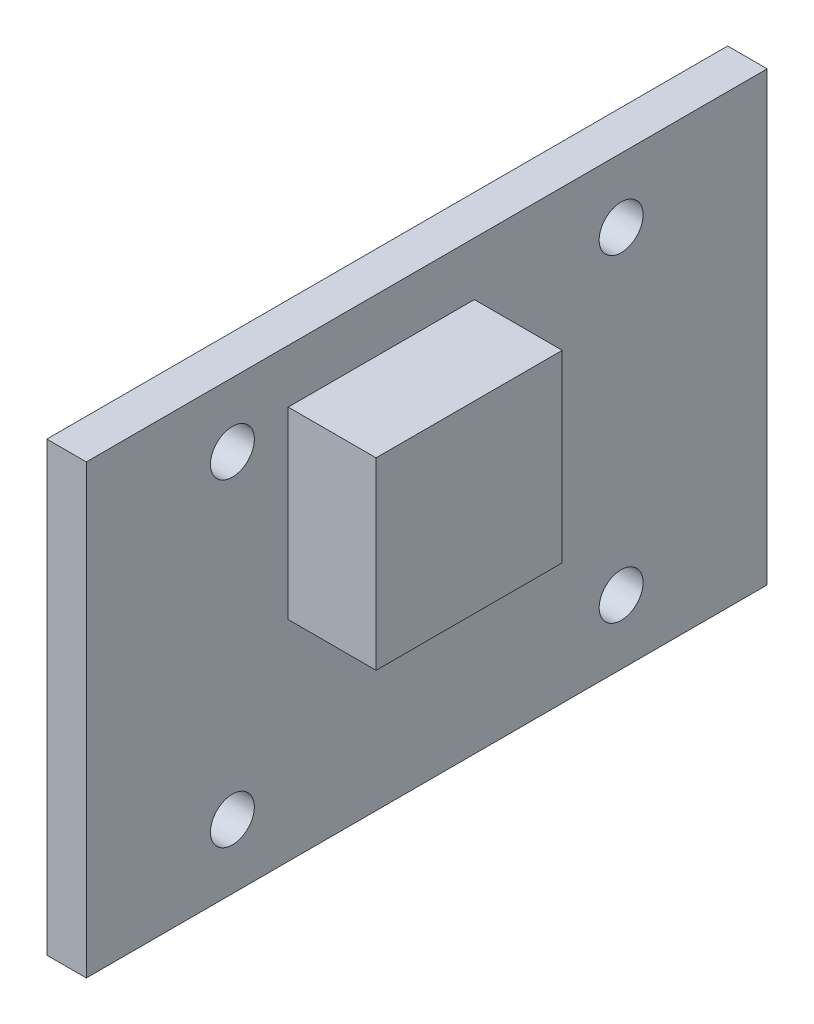
ISO-10303-21;
HEADER;
FILE_DESCRIPTION(('STEP AP214'),'2;1');
FILE_NAME('part.step','',(''),(''),'','','');
FILE_SCHEMA(('AUTOMOTIVE_DESIGN { 1 0 10303 214 1 1 1 1 }'));
ENDSEC;
DATA;
#1=APPLICATION_CONTEXT('core data for automotive mechanical design processes');
#2=APPLICATION_PROTOCOL_DEFINITION('international standard','automotive_design',2000,#1);
#3=PRODUCT_CONTEXT('',#1,'mechanical');
#4=PRODUCT('Part','Part','',(#3));
#5=PRODUCT_RELATED_PRODUCT_CATEGORY('part','',(#4));
#6=PRODUCT_DEFINITION_FORMATION('','',#4);
#7=PRODUCT_DEFINITION_CONTEXT('part definition',#1,'design');
#8=PRODUCT_DEFINITION('design','',#6,#7);
#9=PRODUCT_DEFINITION_SHAPE('','',#8);
#10=(LENGTH_UNIT() NAMED_UNIT(*) SI_UNIT(.MILLI.,.METRE.));
#11=(NAMED_UNIT(*) PLANE_ANGLE_UNIT() SI_UNIT($,.RADIAN.));
#12=(NAMED_UNIT(*) SI_UNIT($,.STERADIAN.) SOLID_ANGLE_UNIT());
#13=UNCERTAINTY_MEASURE_WITH_UNIT(LENGTH_MEASURE(1.E-05),#10,'distance_accuracy_value','');
#14=(GEOMETRIC_REPRESENTATION_CONTEXT(3) GLOBAL_UNCERTAINTY_ASSIGNED_CONTEXT((#13)) GLOBAL_UNIT_ASSIGNED_CONTEXT((#10,
#11,#12)) REPRESENTATION_CONTEXT('',''));
#15=CARTESIAN_POINT('',(0.,0.,0.));
#16=DIRECTION('',(0.,0.,1.));
#17=DIRECTION('',(1.,0.,0.));
#18=AXIS2_PLACEMENT_3D('',#15,#16,#17);
#19=CARTESIAN_POINT('',(1.8,0.,0.));
#20=DIRECTION('',(-1.,0.,0.));
#21=DIRECTION('',(0.,0.,1.));
#22=AXIS2_PLACEMENT_3D('',#19,#20,#21);
#23=PLANE('',#22);
#24=CARTESIAN_POINT('',(1.8,2.925,-24.35));
#25=DIRECTION('',(1.,0.,0.));
#26=DIRECTION('',(0.,0.,-1.));
#27=AXIS2_PLACEMENT_3D('',#24,#25,#26);
#28=CIRCLE('',#27,1.);
#29=CARTESIAN_POINT('',(1.8,2.925,-25.35));
#30=VERTEX_POINT('',#29);
#31=EDGE_CURVE('E147',#30,#30,#28,.T.);
#32=ORIENTED_EDGE('',*,*,#31,.F.);
#33=EDGE_LOOP('',(#32));
#34=FACE_BOUND('',#33,.T.);
#35=CARTESIAN_POINT('',(1.8,17.425,-24.35));
#36=DIRECTION('',(1.,0.,0.));
#37=DIRECTION('',(0.,0.,-1.));
#38=AXIS2_PLACEMENT_3D('',#35,#36,#37);
#39=CIRCLE('',#38,1.);
#40=CARTESIAN_POINT('',(1.8,17.425,-25.35));
#41=VERTEX_POINT('',#40);
#42=EDGE_CURVE('E157',#41,#41,#39,.T.);
#43=ORIENTED_EDGE('',*,*,#42,.F.);
#44=EDGE_LOOP('',(#43));
#45=FACE_BOUND('',#44,.T.);
#46=CARTESIAN_POINT('',(1.8,17.425,-6.65));
#47=DIRECTION('',(1.,0.,0.));
#48=DIRECTION('',(0.,0.,-1.));
#49=AXIS2_PLACEMENT_3D('',#46,#47,#48);
#50=CIRCLE('',#49,1.);
#51=CARTESIAN_POINT('',(1.8,17.425,-7.65));
#52=VERTEX_POINT('',#51);
#53=EDGE_CURVE('E163',#52,#52,#50,.T.);
#54=ORIENTED_EDGE('',*,*,#53,.F.);
#55=EDGE_LOOP('',(#54));
#56=FACE_BOUND('',#55,.T.);
#57=CARTESIAN_POINT('',(1.8,2.925,-6.65));
#58=DIRECTION('',(1.,0.,0.));
#59=DIRECTION('',(0.,0.,-1.));
#60=AXIS2_PLACEMENT_3D('',#57,#58,#59);
#61=CIRCLE('',#60,1.);
#62=CARTESIAN_POINT('',(1.8,2.925,-7.65));
#63=VERTEX_POINT('',#62);
#64=EDGE_CURVE('E170',#63,#63,#61,.T.);
#65=ORIENTED_EDGE('',*,*,#64,.F.);
#66=EDGE_LOOP('',(#65));
#67=FACE_BOUND('',#66,.T.);
#68=DIRECTION('',(0.,-1.,0.));
#69=VECTOR('',#68,1.);
#70=CARTESIAN_POINT('',(1.8,0.,0.));
#71=LINE('',#70,#69);
#72=CARTESIAN_POINT('',(1.8,20.35,0.));
#73=VERTEX_POINT('',#72);
#74=CARTESIAN_POINT('',(1.8,0.,0.));
#75=VERTEX_POINT('',#74);
#76=EDGE_CURVE('E176',#73,#75,#71,.T.);
#77=ORIENTED_EDGE('',*,*,#76,.T.);
#78=DIRECTION('',(0.,0.,-1.));
#79=VECTOR('',#78,1.);
#80=CARTESIAN_POINT('',(1.8,0.,0.));
#81=LINE('',#80,#79);
#82=CARTESIAN_POINT('',(1.8,0.,-31.));
#83=VERTEX_POINT('',#82);
#84=EDGE_CURVE('E179',#75,#83,#81,.T.);
#85=ORIENTED_EDGE('',*,*,#84,.T.);
#86=DIRECTION('',(0.,1.,0.));
#87=VECTOR('',#86,1.);
#88=CARTESIAN_POINT('',(1.8,0.,-31.));
#89=LINE('',#88,#87);
#90=CARTESIAN_POINT('',(1.8,20.35,-31.));
#91=VERTEX_POINT('',#90);
#92=EDGE_CURVE('E182',#83,#91,#89,.T.);
#93=ORIENTED_EDGE('',*,*,#92,.T.);
#94=DIRECTION('',(0.,0.,1.));
#95=VECTOR('',#94,1.);
#96=CARTESIAN_POINT('',(1.8,20.35,0.));
#97=LINE('',#96,#95);
#98=EDGE_CURVE('E184',#91,#73,#97,.T.);
#99=ORIENTED_EDGE('',*,*,#98,.T.);
#100=EDGE_LOOP('',(#77,#85,#93,#99));
#101=FACE_BOUND('',#100,.T.);
#102=DIRECTION('',(0.,-1.,0.));
#103=VECTOR('',#102,1.);
#104=CARTESIAN_POINT('',(1.8,17.9161088988726,-9.1914090465186));
#105=LINE('',#104,#103);
#106=CARTESIAN_POINT('',(1.8,17.9161088988726,-9.1914090465186));
#107=VERTEX_POINT('',#106);
#108=CARTESIAN_POINT('',(1.8,9.53725683145804,-9.1914090465186));
#109=VERTEX_POINT('',#108);
#110=EDGE_CURVE('E140',#107,#109,#105,.T.);
#111=ORIENTED_EDGE('',*,*,#110,.F.);
#112=DIRECTION('',(0.,0.,1.));
#113=VECTOR('',#112,1.);
#114=CARTESIAN_POINT('',(1.8,17.9161088988726,-9.1914090465186));
#115=LINE('',#114,#113);
#116=CARTESIAN_POINT('',(1.8,17.9161088988726,-17.6680687256151));
#117=VERTEX_POINT('',#116);
#118=EDGE_CURVE('E137',#117,#107,#115,.T.);
#119=ORIENTED_EDGE('',*,*,#118,.F.);
#120=DIRECTION('',(0.,1.,0.));
#121=VECTOR('',#120,1.);
#122=CARTESIAN_POINT('',(1.8,17.9161088988726,-17.6680687256151));
#123=LINE('',#122,#121);
#124=CARTESIAN_POINT('',(1.8,9.53725683145804,-17.6680687256151));
#125=VERTEX_POINT('',#124);
#126=EDGE_CURVE('E69',#125,#117,#123,.T.);
#127=ORIENTED_EDGE('',*,*,#126,.F.);
#128=DIRECTION('',(0.,0.,-1.));
#129=VECTOR('',#128,1.);
#130=CARTESIAN_POINT('',(1.8,9.53725683145804,-9.1914090465186));
#131=LINE('',#130,#129);
#132=EDGE_CURVE('E63',#109,#125,#131,.T.);
#133=ORIENTED_EDGE('',*,*,#132,.F.);
#134=EDGE_LOOP('',(#111,#119,#127,#133));
#135=FACE_BOUND('',#134,.T.);
#136=ADVANCED_FACE('F45',(#34,#45,#56,#67,#101,#135),#23,.F.);
#137=CARTESIAN_POINT('',(0.,0.,0.));
#138=DIRECTION('',(-1.,0.,0.));
#139=DIRECTION('',(0.,0.,1.));
#140=AXIS2_PLACEMENT_3D('',#137,#138,#139);
#141=PLANE('',#140);
#142=CARTESIAN_POINT('',(0.,17.425,-24.35));
#143=DIRECTION('',(1.,0.,0.));
#144=DIRECTION('',(0.,0.,-1.));
#145=AXIS2_PLACEMENT_3D('',#142,#143,#144);
#146=CIRCLE('',#145,1.);
#147=CARTESIAN_POINT('',(0.,17.425,-25.35));
#148=VERTEX_POINT('',#147);
#149=EDGE_CURVE('E155',#148,#148,#146,.T.);
#150=ORIENTED_EDGE('',*,*,#149,.T.);
#151=EDGE_LOOP('',(#150));
#152=FACE_BOUND('',#151,.T.);
#153=CARTESIAN_POINT('',(0.,2.925,-6.65));
#154=DIRECTION('',(1.,0.,0.));
#155=DIRECTION('',(0.,0.,-1.));
#156=AXIS2_PLACEMENT_3D('',#153,#154,#155);
#157=CIRCLE('',#156,1.);
#158=CARTESIAN_POINT('',(0.,2.925,-7.65));
#159=VERTEX_POINT('',#158);
#160=EDGE_CURVE('E167',#159,#159,#157,.T.);
#161=ORIENTED_EDGE('',*,*,#160,.T.);
#162=EDGE_LOOP('',(#161));
#163=FACE_BOUND('',#162,.T.);
#164=DIRECTION('',(0.,-1.,0.));
#165=VECTOR('',#164,1.);
#166=CARTESIAN_POINT('',(0.,0.,0.));
#167=LINE('',#166,#165);
#168=CARTESIAN_POINT('',(0.,20.35,0.));
#169=VERTEX_POINT('',#168);
#170=CARTESIAN_POINT('',(0.,0.,0.));
#171=VERTEX_POINT('',#170);
#172=EDGE_CURVE('E173',#169,#171,#167,.T.);
#173=ORIENTED_EDGE('',*,*,#172,.F.);
#174=DIRECTION('',(0.,0.,1.));
#175=VECTOR('',#174,1.);
#176=CARTESIAN_POINT('',(0.,20.35,0.));
#177=LINE('',#176,#175);
#178=CARTESIAN_POINT('',(0.,20.35,-31.));
#179=VERTEX_POINT('',#178);
#180=EDGE_CURVE('E180',#179,#169,#177,.T.);
#181=ORIENTED_EDGE('',*,*,#180,.F.);
#182=DIRECTION('',(0.,1.,0.));
#183=VECTOR('',#182,1.);
#184=CARTESIAN_POINT('',(0.,0.,-31.));
#185=LINE('',#184,#183);
#186=CARTESIAN_POINT('',(0.,0.,-31.));
#187=VERTEX_POINT('',#186);
#188=EDGE_CURVE('E192',#187,#179,#185,.T.);
#189=ORIENTED_EDGE('',*,*,#188,.F.);
#190=DIRECTION('',(0.,0.,-1.));
#191=VECTOR('',#190,1.);
#192=CARTESIAN_POINT('',(0.,0.,0.));
#193=LINE('',#192,#191);
#194=EDGE_CURVE('E190',#171,#187,#193,.T.);
#195=ORIENTED_EDGE('',*,*,#194,.F.);
#196=EDGE_LOOP('',(#173,#181,#189,#195));
#197=FACE_BOUND('',#196,.T.);
#198=CARTESIAN_POINT('',(0.,17.425,-6.65));
#199=DIRECTION('',(1.,0.,0.));
#200=DIRECTION('',(0.,0.,-1.));
#201=AXIS2_PLACEMENT_3D('',#198,#199,#200);
#202=CIRCLE('',#201,1.);
#203=CARTESIAN_POINT('',(0.,17.425,-7.65));
#204=VERTEX_POINT('',#203);
#205=EDGE_CURVE('E160',#204,#204,#202,.T.);
#206=ORIENTED_EDGE('',*,*,#205,.T.);
#207=EDGE_LOOP('',(#206));
#208=FACE_BOUND('',#207,.T.);
#209=CARTESIAN_POINT('',(0.,2.925,-24.35));
#210=DIRECTION('',(1.,0.,0.));
#211=DIRECTION('',(0.,0.,-1.));
#212=AXIS2_PLACEMENT_3D('',#209,#210,#211);
#213=CIRCLE('',#212,1.);
#214=CARTESIAN_POINT('',(0.,2.925,-25.35));
#215=VERTEX_POINT('',#214);
#216=EDGE_CURVE('E142',#215,#215,#213,.T.);
#217=ORIENTED_EDGE('',*,*,#216,.T.);
#218=EDGE_LOOP('',(#217));
#219=FACE_BOUND('',#218,.T.);
#220=ADVANCED_FACE('F210',(#152,#163,#197,#208,#219),#141,.T.);
#221=CARTESIAN_POINT('',(1.8,0.,0.));
#222=DIRECTION('',(0.,0.,-1.));
#223=DIRECTION('',(-1.,0.,0.));
#224=AXIS2_PLACEMENT_3D('',#221,#222,#223);
#225=PLANE('',#224);
#226=ORIENTED_EDGE('',*,*,#172,.T.);
#227=DIRECTION('',(-1.,0.,0.));
#228=VECTOR('',#227,1.);
#229=CARTESIAN_POINT('',(1.8,0.,0.));
#230=LINE('',#229,#228);
#231=EDGE_CURVE('E11',#75,#171,#230,.T.);
#232=ORIENTED_EDGE('',*,*,#231,.F.);
#233=ORIENTED_EDGE('',*,*,#76,.F.);
#234=DIRECTION('',(-1.,0.,0.));
#235=VECTOR('',#234,1.);
#236=CARTESIAN_POINT('',(1.8,20.35,0.));
#237=LINE('',#236,#235);
#238=EDGE_CURVE('E187',#73,#169,#237,.T.);
#239=ORIENTED_EDGE('',*,*,#238,.T.);
#240=EDGE_LOOP('',(#226,#232,#233,#239));
#241=FACE_BOUND('',#240,.T.);
#242=ADVANCED_FACE('F47',(#241),#225,.F.);
#243=CARTESIAN_POINT('',(1.8,0.,0.));
#244=DIRECTION('',(0.,1.,0.));
#245=DIRECTION('',(0.,0.,1.));
#246=AXIS2_PLACEMENT_3D('',#243,#244,#245);
#247=PLANE('',#246);
#248=ORIENTED_EDGE('',*,*,#194,.T.);
#249=DIRECTION('',(-1.,0.,0.));
#250=VECTOR('',#249,1.);
#251=CARTESIAN_POINT('',(1.8,0.,-31.));
#252=LINE('',#251,#250);
#253=EDGE_CURVE('E53',#83,#187,#252,.T.);
#254=ORIENTED_EDGE('',*,*,#253,.F.);
#255=ORIENTED_EDGE('',*,*,#84,.F.);
#256=ORIENTED_EDGE('',*,*,#231,.T.);
#257=EDGE_LOOP('',(#248,#254,#255,#256));
#258=FACE_BOUND('',#257,.T.);
#259=ADVANCED_FACE('F220',(#258),#247,.F.);
#260=CARTESIAN_POINT('',(1.8,0.,-31.));
#261=DIRECTION('',(0.,0.,1.));
#262=DIRECTION('',(1.,0.,0.));
#263=AXIS2_PLACEMENT_3D('',#260,#261,#262);
#264=PLANE('',#263);
#265=ORIENTED_EDGE('',*,*,#188,.T.);
#266=DIRECTION('',(-1.,0.,0.));
#267=VECTOR('',#266,1.);
#268=CARTESIAN_POINT('',(1.8,20.35,-31.));
#269=LINE('',#268,#267);
#270=EDGE_CURVE('E197',#91,#179,#269,.T.);
#271=ORIENTED_EDGE('',*,*,#270,.F.);
#272=ORIENTED_EDGE('',*,*,#92,.F.);
#273=ORIENTED_EDGE('',*,*,#253,.T.);
#274=EDGE_LOOP('',(#265,#271,#272,#273));
#275=FACE_BOUND('',#274,.T.);
#276=ADVANCED_FACE('F204',(#275),#264,.F.);
#277=CARTESIAN_POINT('',(1.8,20.35,0.));
#278=DIRECTION('',(0.,-1.,0.));
#279=DIRECTION('',(0.,0.,-1.));
#280=AXIS2_PLACEMENT_3D('',#277,#278,#279);
#281=PLANE('',#280);
#282=ORIENTED_EDGE('',*,*,#180,.T.);
#283=ORIENTED_EDGE('',*,*,#238,.F.);
#284=ORIENTED_EDGE('',*,*,#98,.F.);
#285=ORIENTED_EDGE('',*,*,#270,.T.);
#286=EDGE_LOOP('',(#282,#283,#284,#285));
#287=FACE_BOUND('',#286,.T.);
#288=ADVANCED_FACE('F214',(#287),#281,.F.);
#289=CARTESIAN_POINT('',(1.8,2.925,-6.65));
#290=DIRECTION('',(-1.,0.,0.));
#291=DIRECTION('',(0.,0.,1.));
#292=AXIS2_PLACEMENT_3D('',#289,#290,#291);
#293=CYLINDRICAL_SURFACE('',#292,1.);
#294=ORIENTED_EDGE('',*,*,#64,.T.);
#295=EDGE_LOOP('',(#294));
#296=FACE_BOUND('',#295,.T.);
#297=ORIENTED_EDGE('',*,*,#160,.F.);
#298=EDGE_LOOP('',(#297));
#299=FACE_BOUND('',#298,.T.);
#300=ADVANCED_FACE('F240',(#296,#299),#293,.F.);
#301=CARTESIAN_POINT('',(1.8,17.425,-6.65));
#302=DIRECTION('',(-1.,0.,0.));
#303=DIRECTION('',(0.,0.,1.));
#304=AXIS2_PLACEMENT_3D('',#301,#302,#303);
#305=CYLINDRICAL_SURFACE('',#304,1.);
#306=ORIENTED_EDGE('',*,*,#53,.T.);
#307=EDGE_LOOP('',(#306));
#308=FACE_BOUND('',#307,.T.);
#309=ORIENTED_EDGE('',*,*,#205,.F.);
#310=EDGE_LOOP('',(#309));
#311=FACE_BOUND('',#310,.T.);
#312=ADVANCED_FACE('F247',(#308,#311),#305,.F.);
#313=CARTESIAN_POINT('',(1.8,17.425,-24.35));
#314=DIRECTION('',(-1.,0.,0.));
#315=DIRECTION('',(0.,0.,1.));
#316=AXIS2_PLACEMENT_3D('',#313,#314,#315);
#317=CYLINDRICAL_SURFACE('',#316,1.);
#318=ORIENTED_EDGE('',*,*,#42,.T.);
#319=EDGE_LOOP('',(#318));
#320=FACE_BOUND('',#319,.T.);
#321=ORIENTED_EDGE('',*,*,#149,.F.);
#322=EDGE_LOOP('',(#321));
#323=FACE_BOUND('',#322,.T.);
#324=ADVANCED_FACE('F252',(#320,#323),#317,.F.);
#325=CARTESIAN_POINT('',(1.8,2.925,-24.35));
#326=DIRECTION('',(-1.,0.,0.));
#327=DIRECTION('',(0.,0.,1.));
#328=AXIS2_PLACEMENT_3D('',#325,#326,#327);
#329=CYLINDRICAL_SURFACE('',#328,1.);
#330=ORIENTED_EDGE('',*,*,#31,.T.);
#331=EDGE_LOOP('',(#330));
#332=FACE_BOUND('',#331,.T.);
#333=ORIENTED_EDGE('',*,*,#216,.F.);
#334=EDGE_LOOP('',(#333));
#335=FACE_BOUND('',#334,.T.);
#336=ADVANCED_FACE('F262',(#332,#335),#329,.F.);
#337=CARTESIAN_POINT('',(5.8,17.9161088988726,-9.1914090465186));
#338=DIRECTION('',(0.,0.,-1.));
#339=DIRECTION('',(-1.,0.,0.));
#340=AXIS2_PLACEMENT_3D('',#337,#338,#339);
#341=PLANE('',#340);
#342=ORIENTED_EDGE('',*,*,#110,.T.);
#343=DIRECTION('',(-1.,0.,0.));
#344=VECTOR('',#343,1.);
#345=CARTESIAN_POINT('',(5.8,9.53725683145804,-9.1914090465186));
#346=LINE('',#345,#344);
#347=CARTESIAN_POINT('',(5.8,9.53725683145804,-9.1914090465186));
#348=VERTEX_POINT('',#347);
#349=EDGE_CURVE('E119',#348,#109,#346,.T.);
#350=ORIENTED_EDGE('',*,*,#349,.F.);
#351=DIRECTION('',(0.,-1.,0.));
#352=VECTOR('',#351,1.);
#353=CARTESIAN_POINT('',(5.8,17.9161088988726,-9.1914090465186));
#354=LINE('',#353,#352);
#355=CARTESIAN_POINT('',(5.8,17.9161088988726,-9.1914090465186));
#356=VERTEX_POINT('',#355);
#357=EDGE_CURVE('E127',#356,#348,#354,.T.);
#358=ORIENTED_EDGE('',*,*,#357,.F.);
#359=DIRECTION('',(-1.,0.,0.));
#360=VECTOR('',#359,1.);
#361=CARTESIAN_POINT('',(5.8,17.9161088988726,-9.1914090465186));
#362=LINE('',#361,#360);
#363=EDGE_CURVE('E365',#356,#107,#362,.T.);
#364=ORIENTED_EDGE('',*,*,#363,.T.);
#365=EDGE_LOOP('',(#342,#350,#358,#364));
#366=FACE_BOUND('',#365,.T.);
#367=ADVANCED_FACE('F139',(#366),#341,.F.);
#368=CARTESIAN_POINT('',(5.8,9.53725683145804,-9.1914090465186));
#369=DIRECTION('',(0.,1.,0.));
#370=DIRECTION('',(0.,0.,1.));
#371=AXIS2_PLACEMENT_3D('',#368,#369,#370);
#372=PLANE('',#371);
#373=ORIENTED_EDGE('',*,*,#132,.T.);
#374=DIRECTION('',(-1.,0.,0.));
#375=VECTOR('',#374,1.);
#376=CARTESIAN_POINT('',(5.8,9.53725683145804,-17.6680687256151));
#377=LINE('',#376,#375);
#378=CARTESIAN_POINT('',(5.8,9.53725683145804,-17.6680687256151));
#379=VERTEX_POINT('',#378);
#380=EDGE_CURVE('E122',#379,#125,#377,.T.);
#381=ORIENTED_EDGE('',*,*,#380,.F.);
#382=DIRECTION('',(0.,0.,-1.));
#383=VECTOR('',#382,1.);
#384=CARTESIAN_POINT('',(5.8,9.53725683145804,-9.1914090465186));
#385=LINE('',#384,#383);
#386=EDGE_CURVE('E115',#348,#379,#385,.T.);
#387=ORIENTED_EDGE('',*,*,#386,.F.);
#388=ORIENTED_EDGE('',*,*,#349,.T.);
#389=EDGE_LOOP('',(#373,#381,#387,#388));
#390=FACE_BOUND('',#389,.T.);
#391=ADVANCED_FACE('F117',(#390),#372,.F.);
#392=CARTESIAN_POINT('',(5.8,17.9161088988726,-17.6680687256151));
#393=DIRECTION('',(0.,0.,1.));
#394=DIRECTION('',(1.,0.,0.));
#395=AXIS2_PLACEMENT_3D('',#392,#393,#394);
#396=PLANE('',#395);
#397=ORIENTED_EDGE('',*,*,#126,.T.);
#398=DIRECTION('',(-1.,0.,0.));
#399=VECTOR('',#398,1.);
#400=CARTESIAN_POINT('',(5.8,17.9161088988726,-17.6680687256151));
#401=LINE('',#400,#399);
#402=CARTESIAN_POINT('',(5.8,17.9161088988726,-17.6680687256151));
#403=VERTEX_POINT('',#402);
#404=EDGE_CURVE('E150',#403,#117,#401,.T.);
#405=ORIENTED_EDGE('',*,*,#404,.F.);
#406=DIRECTION('',(0.,1.,0.));
#407=VECTOR('',#406,1.);
#408=CARTESIAN_POINT('',(5.8,17.9161088988726,-17.6680687256151));
#409=LINE('',#408,#407);
#410=EDGE_CURVE('E126',#379,#403,#409,.T.);
#411=ORIENTED_EDGE('',*,*,#410,.F.);
#412=ORIENTED_EDGE('',*,*,#380,.T.);
#413=EDGE_LOOP('',(#397,#405,#411,#412));
#414=FACE_BOUND('',#413,.T.);
#415=ADVANCED_FACE('F272',(#414),#396,.F.);
#416=CARTESIAN_POINT('',(5.8,17.9161088988726,-9.1914090465186));
#417=DIRECTION('',(0.,-1.,0.));
#418=DIRECTION('',(0.,0.,-1.));
#419=AXIS2_PLACEMENT_3D('',#416,#417,#418);
#420=PLANE('',#419);
#421=ORIENTED_EDGE('',*,*,#118,.T.);
#422=ORIENTED_EDGE('',*,*,#363,.F.);
#423=DIRECTION('',(0.,0.,1.));
#424=VECTOR('',#423,1.);
#425=CARTESIAN_POINT('',(5.8,17.9161088988726,-9.1914090465186));
#426=LINE('',#425,#424);
#427=EDGE_CURVE('E132',#403,#356,#426,.T.);
#428=ORIENTED_EDGE('',*,*,#427,.F.);
#429=ORIENTED_EDGE('',*,*,#404,.T.);
#430=EDGE_LOOP('',(#421,#422,#428,#429));
#431=FACE_BOUND('',#430,.T.);
#432=ADVANCED_FACE('F275',(#431),#420,.F.);
#433=CARTESIAN_POINT('',(5.8,0.,0.));
#434=DIRECTION('',(1.,0.,0.));
#435=DIRECTION('',(0.,0.,-1.));
#436=AXIS2_PLACEMENT_3D('',#433,#434,#435);
#437=PLANE('',#436);
#438=ORIENTED_EDGE('',*,*,#357,.T.);
#439=ORIENTED_EDGE('',*,*,#386,.T.);
#440=ORIENTED_EDGE('',*,*,#410,.T.);
#441=ORIENTED_EDGE('',*,*,#427,.T.);
#442=EDGE_LOOP('',(#438,#439,#440,#441));
#443=FACE_BOUND('',#442,.T.);
#444=ADVANCED_FACE('F130',(#443),#437,.T.);
#445=CLOSED_SHELL('',(#136,#220,#242,#259,#276,#288,#300,#312,#324,#336,#367,#391,#415,#432,#444));
#446=MANIFOLD_SOLID_BREP('B2',#445);
#447=ADVANCED_BREP_SHAPE_REPRESENTATION('',(#18,#446),#14);
#448=SHAPE_DEFINITION_REPRESENTATION(#9,#447);
ENDSEC;
END-ISO-10303-21;
